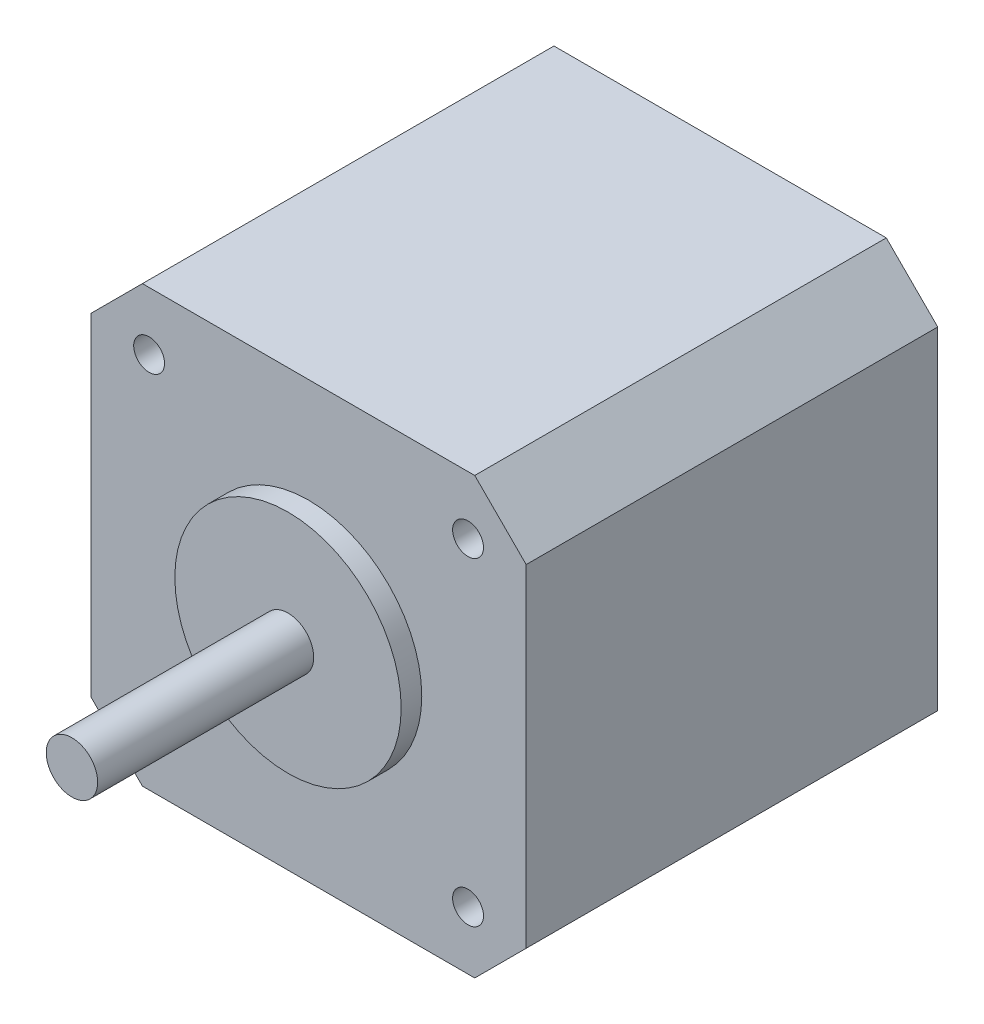
ISO-10303-21;
HEADER;
FILE_DESCRIPTION(('STEP AP214'),'2;1');
FILE_NAME('part.step','',(''),(''),'','','');
FILE_SCHEMA(('AUTOMOTIVE_DESIGN { 1 0 10303 214 1 1 1 1 }'));
ENDSEC;
DATA;
#1=APPLICATION_CONTEXT('core data for automotive mechanical design processes');
#2=APPLICATION_PROTOCOL_DEFINITION('international standard','automotive_design',2000,#1);
#3=PRODUCT_CONTEXT('',#1,'mechanical');
#4=PRODUCT('Part','Part','',(#3));
#5=PRODUCT_RELATED_PRODUCT_CATEGORY('part','',(#4));
#6=PRODUCT_DEFINITION_FORMATION('','',#4);
#7=PRODUCT_DEFINITION_CONTEXT('part definition',#1,'design');
#8=PRODUCT_DEFINITION('design','',#6,#7);
#9=PRODUCT_DEFINITION_SHAPE('','',#8);
#10=(LENGTH_UNIT() NAMED_UNIT(*) SI_UNIT(.MILLI.,.METRE.));
#11=(NAMED_UNIT(*) PLANE_ANGLE_UNIT() SI_UNIT($,.RADIAN.));
#12=(NAMED_UNIT(*) SI_UNIT($,.STERADIAN.) SOLID_ANGLE_UNIT());
#13=UNCERTAINTY_MEASURE_WITH_UNIT(LENGTH_MEASURE(1.E-05),#10,'distance_accuracy_value','');
#14=(GEOMETRIC_REPRESENTATION_CONTEXT(3) GLOBAL_UNCERTAINTY_ASSIGNED_CONTEXT((#13)) GLOBAL_UNIT_ASSIGNED_CONTEXT((#10,
#11,#12)) REPRESENTATION_CONTEXT('',''));
#15=CARTESIAN_POINT('',(0.,0.,0.));
#16=DIRECTION('',(0.,0.,1.));
#17=DIRECTION('',(1.,0.,0.));
#18=AXIS2_PLACEMENT_3D('',#15,#16,#17);
#19=CARTESIAN_POINT('',(0.,0.,20.));
#20=DIRECTION('',(0.,0.,-1.));
#21=DIRECTION('',(-1.,0.,0.));
#22=AXIS2_PLACEMENT_3D('',#19,#20,#21);
#23=PLANE('',#22);
#24=CARTESIAN_POINT('',(0.,0.,20.));
#25=DIRECTION('',(0.,0.,1.));
#26=DIRECTION('',(1.,0.,0.));
#27=AXIS2_PLACEMENT_3D('',#24,#25,#26);
#28=CIRCLE('',#27,11.);
#29=CARTESIAN_POINT('',(11.,0.,20.));
#30=VERTEX_POINT('',#29);
#31=EDGE_CURVE('E157',#30,#30,#28,.T.);
#32=ORIENTED_EDGE('',*,*,#31,.F.);
#33=EDGE_LOOP('',(#32));
#34=FACE_BOUND('',#33,.T.);
#35=DIRECTION('',(0.,-1.,0.));
#36=VECTOR('',#35,1.);
#37=CARTESIAN_POINT('',(-21.15,21.15,20.));
#38=LINE('',#37,#36);
#39=CARTESIAN_POINT('',(-21.15,16.15,20.));
#40=VERTEX_POINT('',#39);
#41=CARTESIAN_POINT('',(-21.15,-16.15,20.));
#42=VERTEX_POINT('',#41);
#43=EDGE_CURVE('E149',#40,#42,#38,.T.);
#44=ORIENTED_EDGE('',*,*,#43,.T.);
#45=DIRECTION('',(-0.707106781186547,0.707106781186548,0.));
#46=VECTOR('',#45,1.);
#47=CARTESIAN_POINT('',(-16.15,-21.15,20.));
#48=LINE('',#47,#46);
#49=CARTESIAN_POINT('',(-16.15,-21.15,20.));
#50=VERTEX_POINT('',#49);
#51=EDGE_CURVE('E179',#42,#50,#48,.F.);
#52=ORIENTED_EDGE('',*,*,#51,.T.);
#53=DIRECTION('',(1.,0.,0.));
#54=VECTOR('',#53,1.);
#55=CARTESIAN_POINT('',(21.15,-21.15,20.));
#56=LINE('',#55,#54);
#57=CARTESIAN_POINT('',(16.15,-21.15,20.));
#58=VERTEX_POINT('',#57);
#59=EDGE_CURVE('E126',#50,#58,#56,.T.);
#60=ORIENTED_EDGE('',*,*,#59,.T.);
#61=DIRECTION('',(-0.70710678118655,-0.707106781186546,0.));
#62=VECTOR('',#61,1.);
#63=CARTESIAN_POINT('',(21.15,-16.15,20.));
#64=LINE('',#63,#62);
#65=CARTESIAN_POINT('',(21.15,-16.15,20.));
#66=VERTEX_POINT('',#65);
#67=EDGE_CURVE('E176',#58,#66,#64,.F.);
#68=ORIENTED_EDGE('',*,*,#67,.T.);
#69=DIRECTION('',(0.,1.,0.));
#70=VECTOR('',#69,1.);
#71=CARTESIAN_POINT('',(21.15,21.15,20.));
#72=LINE('',#71,#70);
#73=CARTESIAN_POINT('',(21.15,16.15,20.));
#74=VERTEX_POINT('',#73);
#75=EDGE_CURVE('E206',#66,#74,#72,.T.);
#76=ORIENTED_EDGE('',*,*,#75,.T.);
#77=DIRECTION('',(0.707106781186546,-0.70710678118655,0.));
#78=VECTOR('',#77,1.);
#79=CARTESIAN_POINT('',(16.15,21.15,20.));
#80=LINE('',#79,#78);
#81=CARTESIAN_POINT('',(16.15,21.15,20.));
#82=VERTEX_POINT('',#81);
#83=EDGE_CURVE('E60',#74,#82,#80,.F.);
#84=ORIENTED_EDGE('',*,*,#83,.T.);
#85=DIRECTION('',(-1.,0.,0.));
#86=VECTOR('',#85,1.);
#87=CARTESIAN_POINT('',(21.15,21.15,20.));
#88=LINE('',#87,#86);
#89=CARTESIAN_POINT('',(-16.15,21.15,20.));
#90=VERTEX_POINT('',#89);
#91=EDGE_CURVE('E193',#82,#90,#88,.T.);
#92=ORIENTED_EDGE('',*,*,#91,.T.);
#93=DIRECTION('',(0.70710678118655,0.707106781186546,0.));
#94=VECTOR('',#93,1.);
#95=CARTESIAN_POINT('',(-21.15,16.15,20.));
#96=LINE('',#95,#94);
#97=EDGE_CURVE('E173',#90,#40,#96,.F.);
#98=ORIENTED_EDGE('',*,*,#97,.T.);
#99=EDGE_LOOP('',(#44,#52,#60,#68,#76,#84,#92,#98));
#100=FACE_BOUND('',#99,.T.);
#101=CARTESIAN_POINT('',(-15.5,15.5,20.));
#102=DIRECTION('',(0.,0.,1.));
#103=DIRECTION('',(1.,0.,0.));
#104=AXIS2_PLACEMENT_3D('',#101,#102,#103);
#105=CIRCLE('',#104,1.5);
#106=CARTESIAN_POINT('',(-14.,15.5,20.));
#107=VERTEX_POINT('',#106);
#108=EDGE_CURVE('E143',#107,#107,#105,.T.);
#109=ORIENTED_EDGE('',*,*,#108,.F.);
#110=EDGE_LOOP('',(#109));
#111=FACE_BOUND('',#110,.T.);
#112=CARTESIAN_POINT('',(-15.5,-15.5,20.));
#113=DIRECTION('',(0.,0.,1.));
#114=DIRECTION('',(1.,0.,0.));
#115=AXIS2_PLACEMENT_3D('',#112,#113,#114);
#116=CIRCLE('',#115,1.5);
#117=CARTESIAN_POINT('',(-14.,-15.5,20.));
#118=VERTEX_POINT('',#117);
#119=EDGE_CURVE('E239',#118,#118,#116,.T.);
#120=ORIENTED_EDGE('',*,*,#119,.F.);
#121=EDGE_LOOP('',(#120));
#122=FACE_BOUND('',#121,.T.);
#123=CARTESIAN_POINT('',(15.5,-15.5,20.));
#124=DIRECTION('',(0.,0.,1.));
#125=DIRECTION('',(-1.,0.,0.));
#126=AXIS2_PLACEMENT_3D('',#123,#124,#125);
#127=CIRCLE('',#126,1.5);
#128=CARTESIAN_POINT('',(14.,-15.5,20.));
#129=VERTEX_POINT('',#128);
#130=EDGE_CURVE('E231',#129,#129,#127,.T.);
#131=ORIENTED_EDGE('',*,*,#130,.F.);
#132=EDGE_LOOP('',(#131));
#133=FACE_BOUND('',#132,.T.);
#134=CARTESIAN_POINT('',(15.5,15.5,20.));
#135=DIRECTION('',(0.,0.,1.));
#136=DIRECTION('',(-1.,0.,0.));
#137=AXIS2_PLACEMENT_3D('',#134,#135,#136);
#138=CIRCLE('',#137,1.5);
#139=CARTESIAN_POINT('',(14.,15.5,20.));
#140=VERTEX_POINT('',#139);
#141=EDGE_CURVE('E222',#140,#140,#138,.T.);
#142=ORIENTED_EDGE('',*,*,#141,.F.);
#143=EDGE_LOOP('',(#142));
#144=FACE_BOUND('',#143,.T.);
#145=ADVANCED_FACE('F39',(#34,#100,#111,#122,#133,#144),#23,.F.);
#146=CARTESIAN_POINT('',(0.,0.,-20.));
#147=DIRECTION('',(0.,0.,-1.));
#148=DIRECTION('',(-1.,0.,0.));
#149=AXIS2_PLACEMENT_3D('',#146,#147,#148);
#150=PLANE('',#149);
#151=CARTESIAN_POINT('',(15.5,-15.5,-20.));
#152=DIRECTION('',(0.,0.,1.));
#153=DIRECTION('',(-1.,0.,0.));
#154=AXIS2_PLACEMENT_3D('',#151,#152,#153);
#155=CIRCLE('',#154,1.5);
#156=CARTESIAN_POINT('',(14.,-15.5,-20.));
#157=VERTEX_POINT('',#156);
#158=EDGE_CURVE('E226',#157,#157,#155,.T.);
#159=ORIENTED_EDGE('',*,*,#158,.T.);
#160=EDGE_LOOP('',(#159));
#161=FACE_BOUND('',#160,.T.);
#162=CARTESIAN_POINT('',(-15.5,15.5,-20.));
#163=DIRECTION('',(0.,0.,1.));
#164=DIRECTION('',(1.,0.,0.));
#165=AXIS2_PLACEMENT_3D('',#162,#163,#164);
#166=CIRCLE('',#165,1.5);
#167=CARTESIAN_POINT('',(-14.,15.5,-20.));
#168=VERTEX_POINT('',#167);
#169=EDGE_CURVE('E209',#168,#168,#166,.T.);
#170=ORIENTED_EDGE('',*,*,#169,.T.);
#171=EDGE_LOOP('',(#170));
#172=FACE_BOUND('',#171,.T.);
#173=DIRECTION('',(1.,0.,0.));
#174=VECTOR('',#173,1.);
#175=CARTESIAN_POINT('',(21.15,-21.15,-20.));
#176=LINE('',#175,#174);
#177=CARTESIAN_POINT('',(-16.15,-21.15,-20.));
#178=VERTEX_POINT('',#177);
#179=CARTESIAN_POINT('',(16.15,-21.15,-20.));
#180=VERTEX_POINT('',#179);
#181=EDGE_CURVE('E123',#178,#180,#176,.T.);
#182=ORIENTED_EDGE('',*,*,#181,.F.);
#183=DIRECTION('',(0.707106781186547,-0.707106781186548,0.));
#184=VECTOR('',#183,1.);
#185=CARTESIAN_POINT('',(-18.65,-18.65,-20.));
#186=LINE('',#185,#184);
#187=CARTESIAN_POINT('',(-21.15,-16.15,-20.));
#188=VERTEX_POINT('',#187);
#189=EDGE_CURVE('E105',#178,#188,#186,.F.);
#190=ORIENTED_EDGE('',*,*,#189,.T.);
#191=DIRECTION('',(0.,-1.,0.));
#192=VECTOR('',#191,1.);
#193=CARTESIAN_POINT('',(-21.15,21.15,-20.));
#194=LINE('',#193,#192);
#195=CARTESIAN_POINT('',(-21.15,16.15,-20.));
#196=VERTEX_POINT('',#195);
#197=EDGE_CURVE('E136',#196,#188,#194,.T.);
#198=ORIENTED_EDGE('',*,*,#197,.F.);
#199=DIRECTION('',(-0.70710678118655,-0.707106781186546,0.));
#200=VECTOR('',#199,1.);
#201=CARTESIAN_POINT('',(-18.6499999999999,18.65,-20.));
#202=LINE('',#201,#200);
#203=CARTESIAN_POINT('',(-16.15,21.15,-20.));
#204=VERTEX_POINT('',#203);
#205=EDGE_CURVE('E161',#196,#204,#202,.F.);
#206=ORIENTED_EDGE('',*,*,#205,.T.);
#207=DIRECTION('',(-1.,0.,0.));
#208=VECTOR('',#207,1.);
#209=CARTESIAN_POINT('',(21.15,21.15,-20.));
#210=LINE('',#209,#208);
#211=CARTESIAN_POINT('',(16.15,21.15,-20.));
#212=VERTEX_POINT('',#211);
#213=EDGE_CURVE('E141',#212,#204,#210,.T.);
#214=ORIENTED_EDGE('',*,*,#213,.F.);
#215=DIRECTION('',(-0.707106781186546,0.70710678118655,0.));
#216=VECTOR('',#215,1.);
#217=CARTESIAN_POINT('',(18.65,18.6499999999999,-20.));
#218=LINE('',#217,#216);
#219=CARTESIAN_POINT('',(21.15,16.15,-20.));
#220=VERTEX_POINT('',#219);
#221=EDGE_CURVE('E128',#212,#220,#218,.F.);
#222=ORIENTED_EDGE('',*,*,#221,.T.);
#223=DIRECTION('',(0.,1.,0.));
#224=VECTOR('',#223,1.);
#225=CARTESIAN_POINT('',(21.15,21.15,-20.));
#226=LINE('',#225,#224);
#227=CARTESIAN_POINT('',(21.15,-16.15,-20.));
#228=VERTEX_POINT('',#227);
#229=EDGE_CURVE('E135',#228,#220,#226,.T.);
#230=ORIENTED_EDGE('',*,*,#229,.F.);
#231=DIRECTION('',(0.70710678118655,0.707106781186546,0.));
#232=VECTOR('',#231,1.);
#233=CARTESIAN_POINT('',(18.6499999999999,-18.65,-20.));
#234=LINE('',#233,#232);
#235=EDGE_CURVE('E117',#228,#180,#234,.F.);
#236=ORIENTED_EDGE('',*,*,#235,.T.);
#237=EDGE_LOOP('',(#182,#190,#198,#206,#214,#222,#230,#236));
#238=FACE_BOUND('',#237,.T.);
#239=CARTESIAN_POINT('',(-15.5,-15.5,-20.));
#240=DIRECTION('',(0.,0.,1.));
#241=DIRECTION('',(1.,0.,0.));
#242=AXIS2_PLACEMENT_3D('',#239,#240,#241);
#243=CIRCLE('',#242,1.5);
#244=CARTESIAN_POINT('',(-14.,-15.5,-20.));
#245=VERTEX_POINT('',#244);
#246=EDGE_CURVE('E235',#245,#245,#243,.T.);
#247=ORIENTED_EDGE('',*,*,#246,.T.);
#248=EDGE_LOOP('',(#247));
#249=FACE_BOUND('',#248,.T.);
#250=CARTESIAN_POINT('',(15.5,15.5,-20.));
#251=DIRECTION('',(0.,0.,1.));
#252=DIRECTION('',(-1.,0.,0.));
#253=AXIS2_PLACEMENT_3D('',#250,#251,#252);
#254=CIRCLE('',#253,1.5);
#255=CARTESIAN_POINT('',(14.,15.5,-20.));
#256=VERTEX_POINT('',#255);
#257=EDGE_CURVE('E227',#256,#256,#254,.T.);
#258=ORIENTED_EDGE('',*,*,#257,.T.);
#259=EDGE_LOOP('',(#258));
#260=FACE_BOUND('',#259,.T.);
#261=ADVANCED_FACE('F131',(#161,#172,#238,#249,#260),#150,.T.);
#262=CARTESIAN_POINT('',(-21.15,21.15,20.));
#263=DIRECTION('',(1.,0.,0.));
#264=DIRECTION('',(0.,0.,-1.));
#265=AXIS2_PLACEMENT_3D('',#262,#263,#264);
#266=PLANE('',#265);
#267=ORIENTED_EDGE('',*,*,#197,.T.);
#268=DIRECTION('',(0.,0.,1.));
#269=VECTOR('',#268,1.);
#270=CARTESIAN_POINT('',(-21.15,-16.15,20.));
#271=LINE('',#270,#269);
#272=EDGE_CURVE('E110',#188,#42,#271,.T.);
#273=ORIENTED_EDGE('',*,*,#272,.T.);
#274=ORIENTED_EDGE('',*,*,#43,.F.);
#275=DIRECTION('',(0.,0.,-1.));
#276=VECTOR('',#275,1.);
#277=CARTESIAN_POINT('',(-21.15,16.15,20.));
#278=LINE('',#277,#276);
#279=EDGE_CURVE('E116',#40,#196,#278,.T.);
#280=ORIENTED_EDGE('',*,*,#279,.T.);
#281=EDGE_LOOP('',(#267,#273,#274,#280));
#282=FACE_BOUND('',#281,.T.);
#283=ADVANCED_FACE('F201',(#282),#266,.F.);
#284=CARTESIAN_POINT('',(21.15,-21.15,20.));
#285=DIRECTION('',(0.,1.,0.));
#286=DIRECTION('',(-1.,0.,0.));
#287=AXIS2_PLACEMENT_3D('',#284,#285,#286);
#288=PLANE('',#287);
#289=ORIENTED_EDGE('',*,*,#59,.F.);
#290=DIRECTION('',(0.,0.,-1.));
#291=VECTOR('',#290,1.);
#292=CARTESIAN_POINT('',(-16.15,-21.15,20.));
#293=LINE('',#292,#291);
#294=EDGE_CURVE('E109',#50,#178,#293,.T.);
#295=ORIENTED_EDGE('',*,*,#294,.T.);
#296=ORIENTED_EDGE('',*,*,#181,.T.);
#297=DIRECTION('',(0.,0.,1.));
#298=VECTOR('',#297,1.);
#299=CARTESIAN_POINT('',(16.15,-21.15,20.));
#300=LINE('',#299,#298);
#301=EDGE_CURVE('E129',#180,#58,#300,.T.);
#302=ORIENTED_EDGE('',*,*,#301,.T.);
#303=EDGE_LOOP('',(#289,#295,#296,#302));
#304=FACE_BOUND('',#303,.T.);
#305=ADVANCED_FACE('F122',(#304),#288,.F.);
#306=CARTESIAN_POINT('',(21.15,21.15,20.));
#307=DIRECTION('',(-1.,0.,0.));
#308=DIRECTION('',(0.,-1.,0.));
#309=AXIS2_PLACEMENT_3D('',#306,#307,#308);
#310=PLANE('',#309);
#311=ORIENTED_EDGE('',*,*,#75,.F.);
#312=DIRECTION('',(0.,0.,-1.));
#313=VECTOR('',#312,1.);
#314=CARTESIAN_POINT('',(21.15,-16.15,20.));
#315=LINE('',#314,#313);
#316=EDGE_CURVE('E185',#66,#228,#315,.T.);
#317=ORIENTED_EDGE('',*,*,#316,.T.);
#318=ORIENTED_EDGE('',*,*,#229,.T.);
#319=DIRECTION('',(0.,0.,1.));
#320=VECTOR('',#319,1.);
#321=CARTESIAN_POINT('',(21.15,16.15,20.));
#322=LINE('',#321,#320);
#323=EDGE_CURVE('E182',#220,#74,#322,.T.);
#324=ORIENTED_EDGE('',*,*,#323,.T.);
#325=EDGE_LOOP('',(#311,#317,#318,#324));
#326=FACE_BOUND('',#325,.T.);
#327=ADVANCED_FACE('F265',(#326),#310,.F.);
#328=CARTESIAN_POINT('',(21.15,21.15,20.));
#329=DIRECTION('',(0.,-1.,0.));
#330=DIRECTION('',(1.,0.,0.));
#331=AXIS2_PLACEMENT_3D('',#328,#329,#330);
#332=PLANE('',#331);
#333=ORIENTED_EDGE('',*,*,#213,.T.);
#334=DIRECTION('',(0.,0.,1.));
#335=VECTOR('',#334,1.);
#336=CARTESIAN_POINT('',(-16.15,21.15,20.));
#337=LINE('',#336,#335);
#338=EDGE_CURVE('E11',#204,#90,#337,.T.);
#339=ORIENTED_EDGE('',*,*,#338,.T.);
#340=ORIENTED_EDGE('',*,*,#91,.F.);
#341=DIRECTION('',(0.,0.,-1.));
#342=VECTOR('',#341,1.);
#343=CARTESIAN_POINT('',(16.15,21.15,20.));
#344=LINE('',#343,#342);
#345=EDGE_CURVE('E48',#82,#212,#344,.T.);
#346=ORIENTED_EDGE('',*,*,#345,.T.);
#347=EDGE_LOOP('',(#333,#339,#340,#346));
#348=FACE_BOUND('',#347,.T.);
#349=ADVANCED_FACE('F192',(#348),#332,.F.);
#350=CARTESIAN_POINT('',(-15.5,15.5,20.));
#351=DIRECTION('',(0.,0.,-1.));
#352=DIRECTION('',(-1.,0.,0.));
#353=AXIS2_PLACEMENT_3D('',#350,#351,#352);
#354=CYLINDRICAL_SURFACE('',#353,1.5);
#355=ORIENTED_EDGE('',*,*,#108,.T.);
#356=EDGE_LOOP('',(#355));
#357=FACE_BOUND('',#356,.T.);
#358=ORIENTED_EDGE('',*,*,#169,.F.);
#359=EDGE_LOOP('',(#358));
#360=FACE_BOUND('',#359,.T.);
#361=ADVANCED_FACE('F254',(#357,#360),#354,.F.);
#362=CARTESIAN_POINT('',(-15.5,-15.5,20.));
#363=DIRECTION('',(0.,0.,-1.));
#364=DIRECTION('',(-1.,0.,0.));
#365=AXIS2_PLACEMENT_3D('',#362,#363,#364);
#366=CYLINDRICAL_SURFACE('',#365,1.5);
#367=ORIENTED_EDGE('',*,*,#119,.T.);
#368=EDGE_LOOP('',(#367));
#369=FACE_BOUND('',#368,.T.);
#370=ORIENTED_EDGE('',*,*,#246,.F.);
#371=EDGE_LOOP('',(#370));
#372=FACE_BOUND('',#371,.T.);
#373=ADVANCED_FACE('F256',(#369,#372),#366,.F.);
#374=CARTESIAN_POINT('',(15.5,-15.5,20.));
#375=DIRECTION('',(0.,0.,-1.));
#376=DIRECTION('',(-1.,0.,0.));
#377=AXIS2_PLACEMENT_3D('',#374,#375,#376);
#378=CYLINDRICAL_SURFACE('',#377,1.5);
#379=ORIENTED_EDGE('',*,*,#130,.T.);
#380=EDGE_LOOP('',(#379));
#381=FACE_BOUND('',#380,.T.);
#382=ORIENTED_EDGE('',*,*,#158,.F.);
#383=EDGE_LOOP('',(#382));
#384=FACE_BOUND('',#383,.T.);
#385=ADVANCED_FACE('F262',(#381,#384),#378,.F.);
#386=CARTESIAN_POINT('',(15.5,15.5,20.));
#387=DIRECTION('',(0.,0.,-1.));
#388=DIRECTION('',(-1.,0.,0.));
#389=AXIS2_PLACEMENT_3D('',#386,#387,#388);
#390=CYLINDRICAL_SURFACE('',#389,1.5);
#391=ORIENTED_EDGE('',*,*,#141,.T.);
#392=EDGE_LOOP('',(#391));
#393=FACE_BOUND('',#392,.T.);
#394=ORIENTED_EDGE('',*,*,#257,.F.);
#395=EDGE_LOOP('',(#394));
#396=FACE_BOUND('',#395,.T.);
#397=ADVANCED_FACE('F307',(#393,#396),#390,.F.);
#398=CARTESIAN_POINT('',(0.,0.,22.));
#399=DIRECTION('',(0.,0.,-1.));
#400=DIRECTION('',(-1.,0.,0.));
#401=AXIS2_PLACEMENT_3D('',#398,#399,#400);
#402=CYLINDRICAL_SURFACE('',#401,11.);
#403=CARTESIAN_POINT('',(0.,0.,22.));
#404=DIRECTION('',(0.,0.,1.));
#405=DIRECTION('',(1.,0.,0.));
#406=AXIS2_PLACEMENT_3D('',#403,#404,#405);
#407=CIRCLE('',#406,11.);
#408=CARTESIAN_POINT('',(11.,0.,22.));
#409=VERTEX_POINT('',#408);
#410=EDGE_CURVE('E154',#409,#409,#407,.T.);
#411=ORIENTED_EDGE('',*,*,#410,.F.);
#412=EDGE_LOOP('',(#411));
#413=FACE_BOUND('',#412,.T.);
#414=ORIENTED_EDGE('',*,*,#31,.T.);
#415=EDGE_LOOP('',(#414));
#416=FACE_BOUND('',#415,.T.);
#417=ADVANCED_FACE('F310',(#413,#416),#402,.T.);
#418=CARTESIAN_POINT('',(0.,0.,22.));
#419=DIRECTION('',(0.,0.,1.));
#420=DIRECTION('',(1.,0.,0.));
#421=AXIS2_PLACEMENT_3D('',#418,#419,#420);
#422=PLANE('',#421);
#423=CARTESIAN_POINT('',(0.,0.,22.));
#424=DIRECTION('',(0.,0.,1.));
#425=DIRECTION('',(1.,0.,0.));
#426=AXIS2_PLACEMENT_3D('',#423,#424,#425);
#427=CIRCLE('',#426,2.5);
#428=CARTESIAN_POINT('',(2.5,0.,22.));
#429=VERTEX_POINT('',#428);
#430=EDGE_CURVE('E150',#429,#429,#427,.F.);
#431=ORIENTED_EDGE('',*,*,#430,.T.);
#432=EDGE_LOOP('',(#431));
#433=FACE_BOUND('',#432,.T.);
#434=ORIENTED_EDGE('',*,*,#410,.T.);
#435=EDGE_LOOP('',(#434));
#436=FACE_BOUND('',#435,.T.);
#437=ADVANCED_FACE('F318',(#433,#436),#422,.T.);
#438=CARTESIAN_POINT('',(0.,0.,43.));
#439=DIRECTION('',(0.,0.,-1.));
#440=DIRECTION('',(-1.,0.,0.));
#441=AXIS2_PLACEMENT_3D('',#438,#439,#440);
#442=CYLINDRICAL_SURFACE('',#441,2.5);
#443=ORIENTED_EDGE('',*,*,#430,.F.);
#444=EDGE_LOOP('',(#443));
#445=FACE_BOUND('',#444,.T.);
#446=CARTESIAN_POINT('',(0.,0.,43.));
#447=DIRECTION('',(0.,0.,1.));
#448=DIRECTION('',(1.,0.,0.));
#449=AXIS2_PLACEMENT_3D('',#446,#447,#448);
#450=CIRCLE('',#449,2.5);
#451=CARTESIAN_POINT('',(2.5,0.,43.));
#452=VERTEX_POINT('',#451);
#453=EDGE_CURVE('E155',#452,#452,#450,.T.);
#454=ORIENTED_EDGE('',*,*,#453,.F.);
#455=EDGE_LOOP('',(#454));
#456=FACE_BOUND('',#455,.T.);
#457=ADVANCED_FACE('F326',(#445,#456),#442,.T.);
#458=CARTESIAN_POINT('',(0.,0.,43.));
#459=DIRECTION('',(0.,0.,1.));
#460=DIRECTION('',(1.,0.,0.));
#461=AXIS2_PLACEMENT_3D('',#458,#459,#460);
#462=PLANE('',#461);
#463=ORIENTED_EDGE('',*,*,#453,.T.);
#464=EDGE_LOOP('',(#463));
#465=FACE_BOUND('',#464,.T.);
#466=ADVANCED_FACE('F286',(#465),#462,.T.);
#467=CARTESIAN_POINT('',(-16.15,-21.15,20.));
#468=DIRECTION('',(0.707106781186548,0.707106781186547,0.));
#469=DIRECTION('',(0.,0.,-1.));
#470=AXIS2_PLACEMENT_3D('',#467,#468,#469);
#471=PLANE('',#470);
#472=ORIENTED_EDGE('',*,*,#51,.F.);
#473=ORIENTED_EDGE('',*,*,#272,.F.);
#474=ORIENTED_EDGE('',*,*,#189,.F.);
#475=ORIENTED_EDGE('',*,*,#294,.F.);
#476=EDGE_LOOP('',(#472,#473,#474,#475));
#477=FACE_BOUND('',#476,.T.);
#478=ADVANCED_FACE('F108',(#477),#471,.F.);
#479=CARTESIAN_POINT('',(21.15,-16.15,20.));
#480=DIRECTION('',(-0.707106781186546,0.70710678118655,0.));
#481=DIRECTION('',(0.,0.,-1.));
#482=AXIS2_PLACEMENT_3D('',#479,#480,#481);
#483=PLANE('',#482);
#484=ORIENTED_EDGE('',*,*,#67,.F.);
#485=ORIENTED_EDGE('',*,*,#301,.F.);
#486=ORIENTED_EDGE('',*,*,#235,.F.);
#487=ORIENTED_EDGE('',*,*,#316,.F.);
#488=EDGE_LOOP('',(#484,#485,#486,#487));
#489=FACE_BOUND('',#488,.T.);
#490=ADVANCED_FACE('F285',(#489),#483,.F.);
#491=CARTESIAN_POINT('',(-21.15,16.15,20.));
#492=DIRECTION('',(0.707106781186546,-0.70710678118655,0.));
#493=DIRECTION('',(0.,0.,-1.));
#494=AXIS2_PLACEMENT_3D('',#491,#492,#493);
#495=PLANE('',#494);
#496=ORIENTED_EDGE('',*,*,#97,.F.);
#497=ORIENTED_EDGE('',*,*,#338,.F.);
#498=ORIENTED_EDGE('',*,*,#205,.F.);
#499=ORIENTED_EDGE('',*,*,#279,.F.);
#500=EDGE_LOOP('',(#496,#497,#498,#499));
#501=FACE_BOUND('',#500,.T.);
#502=ADVANCED_FACE('F198',(#501),#495,.F.);
#503=CARTESIAN_POINT('',(16.15,21.15,20.));
#504=DIRECTION('',(-0.70710678118655,-0.707106781186546,0.));
#505=DIRECTION('',(0.,0.,-1.));
#506=AXIS2_PLACEMENT_3D('',#503,#504,#505);
#507=PLANE('',#506);
#508=ORIENTED_EDGE('',*,*,#83,.F.);
#509=ORIENTED_EDGE('',*,*,#323,.F.);
#510=ORIENTED_EDGE('',*,*,#221,.F.);
#511=ORIENTED_EDGE('',*,*,#345,.F.);
#512=EDGE_LOOP('',(#508,#509,#510,#511));
#513=FACE_BOUND('',#512,.T.);
#514=ADVANCED_FACE('F41',(#513),#507,.F.);
#515=CLOSED_SHELL('',(#145,#261,#283,#305,#327,#349,#361,#373,#385,#397,#417,#437,#457,#466,
#478,#490,#502,#514));
#516=MANIFOLD_SOLID_BREP('B2',#515);
#517=ADVANCED_BREP_SHAPE_REPRESENTATION('',(#18,#516),#14);
#518=SHAPE_DEFINITION_REPRESENTATION(#9,#517);
ENDSEC;
END-ISO-10303-21;
